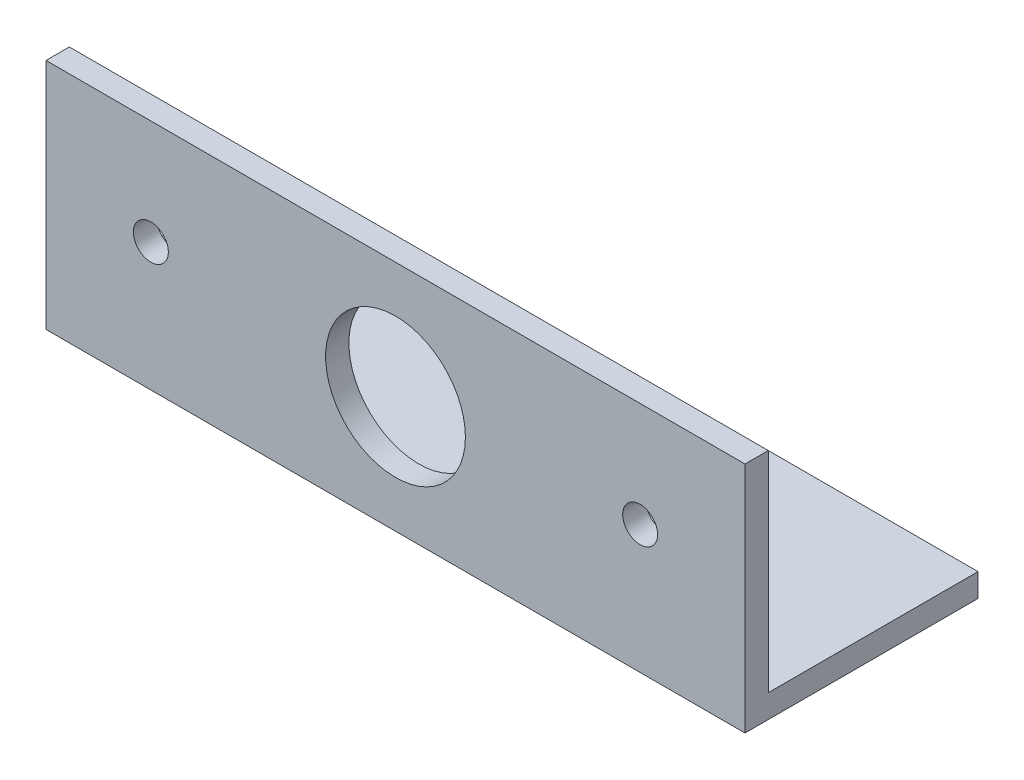
ISO-10303-21;
HEADER;
FILE_DESCRIPTION(('STEP AP214'),'2;1');
FILE_NAME('part.step','',(''),(''),'','','');
FILE_SCHEMA(('AUTOMOTIVE_DESIGN { 1 0 10303 214 1 1 1 1 }'));
ENDSEC;
DATA;
#1=APPLICATION_CONTEXT('core data for automotive mechanical design processes');
#2=APPLICATION_PROTOCOL_DEFINITION('international standard','automotive_design',2000,#1);
#3=PRODUCT_CONTEXT('',#1,'mechanical');
#4=PRODUCT('Part','Part','',(#3));
#5=PRODUCT_RELATED_PRODUCT_CATEGORY('part','',(#4));
#6=PRODUCT_DEFINITION_FORMATION('','',#4);
#7=PRODUCT_DEFINITION_CONTEXT('part definition',#1,'design');
#8=PRODUCT_DEFINITION('design','',#6,#7);
#9=PRODUCT_DEFINITION_SHAPE('','',#8);
#10=(LENGTH_UNIT() NAMED_UNIT(*) SI_UNIT(.MILLI.,.METRE.));
#11=(NAMED_UNIT(*) PLANE_ANGLE_UNIT() SI_UNIT($,.RADIAN.));
#12=(NAMED_UNIT(*) SI_UNIT($,.STERADIAN.) SOLID_ANGLE_UNIT());
#13=UNCERTAINTY_MEASURE_WITH_UNIT(LENGTH_MEASURE(1.E-05),#10,'distance_accuracy_value','');
#14=(GEOMETRIC_REPRESENTATION_CONTEXT(3) GLOBAL_UNCERTAINTY_ASSIGNED_CONTEXT((#13)) GLOBAL_UNIT_ASSIGNED_CONTEXT((#10,
#11,#12)) REPRESENTATION_CONTEXT('',''));
#15=CARTESIAN_POINT('',(0.,0.,0.));
#16=DIRECTION('',(0.,0.,1.));
#17=DIRECTION('',(1.,0.,0.));
#18=AXIS2_PLACEMENT_3D('',#15,#16,#17);
#19=CARTESIAN_POINT('',(-30.,20.,0.));
#20=DIRECTION('',(0.,1.,0.));
#21=DIRECTION('',(0.,0.,1.));
#22=AXIS2_PLACEMENT_3D('',#19,#20,#21);
#23=PLANE('',#22);
#24=DIRECTION('',(1.,0.,0.));
#25=VECTOR('',#24,1.);
#26=CARTESIAN_POINT('',(-30.,20.,0.));
#27=LINE('',#26,#25);
#28=CARTESIAN_POINT('',(-30.,20.,0.));
#29=VERTEX_POINT('',#28);
#30=CARTESIAN_POINT('',(30.,20.,0.));
#31=VERTEX_POINT('',#30);
#32=EDGE_CURVE('E44',#29,#31,#27,.T.);
#33=ORIENTED_EDGE('',*,*,#32,.T.);
#34=DIRECTION('',(0.,0.,1.));
#35=VECTOR('',#34,1.);
#36=CARTESIAN_POINT('',(30.,20.,0.));
#37=LINE('',#36,#35);
#38=CARTESIAN_POINT('',(30.,20.,-2.));
#39=VERTEX_POINT('',#38);
#40=EDGE_CURVE('E93',#39,#31,#37,.T.);
#41=ORIENTED_EDGE('',*,*,#40,.F.);
#42=DIRECTION('',(1.,0.,0.));
#43=VECTOR('',#42,1.);
#44=CARTESIAN_POINT('',(-30.,20.,-2.));
#45=LINE('',#44,#43);
#46=CARTESIAN_POINT('',(-30.,20.,-2.));
#47=VERTEX_POINT('',#46);
#48=EDGE_CURVE('E11',#47,#39,#45,.T.);
#49=ORIENTED_EDGE('',*,*,#48,.F.);
#50=DIRECTION('',(0.,0.,1.));
#51=VECTOR('',#50,1.);
#52=CARTESIAN_POINT('',(-30.,20.,0.));
#53=LINE('',#52,#51);
#54=EDGE_CURVE('E94',#47,#29,#53,.T.);
#55=ORIENTED_EDGE('',*,*,#54,.T.);
#56=EDGE_LOOP('',(#33,#41,#49,#55));
#57=FACE_BOUND('',#56,.T.);
#58=ADVANCED_FACE('F41',(#57),#23,.T.);
#59=CARTESIAN_POINT('',(-30.,2.,-2.));
#60=DIRECTION('',(0.,0.,-1.));
#61=DIRECTION('',(0.,1.,0.));
#62=AXIS2_PLACEMENT_3D('',#59,#60,#61);
#63=PLANE('',#62);
#64=CARTESIAN_POINT('',(-21.,11.,-2.));
#65=DIRECTION('',(0.,0.,1.));
#66=DIRECTION('',(1.,0.,0.));
#67=AXIS2_PLACEMENT_3D('',#64,#65,#66);
#68=CIRCLE('',#67,1.5);
#69=CARTESIAN_POINT('',(-19.5,11.,-2.));
#70=VERTEX_POINT('',#69);
#71=EDGE_CURVE('E112',#70,#70,#68,.T.);
#72=ORIENTED_EDGE('',*,*,#71,.T.);
#73=EDGE_LOOP('',(#72));
#74=FACE_BOUND('',#73,.T.);
#75=CARTESIAN_POINT('',(21.,11.,-2.));
#76=DIRECTION('',(0.,0.,1.));
#77=DIRECTION('',(1.,0.,0.));
#78=AXIS2_PLACEMENT_3D('',#75,#76,#77);
#79=CIRCLE('',#78,1.5);
#80=CARTESIAN_POINT('',(22.5,11.,-2.));
#81=VERTEX_POINT('',#80);
#82=EDGE_CURVE('E192',#81,#81,#79,.T.);
#83=ORIENTED_EDGE('',*,*,#82,.T.);
#84=EDGE_LOOP('',(#83));
#85=FACE_BOUND('',#84,.T.);
#86=CARTESIAN_POINT('',(0.,10.,-2.));
#87=DIRECTION('',(0.,0.,1.));
#88=DIRECTION('',(1.,0.,0.));
#89=AXIS2_PLACEMENT_3D('',#86,#87,#88);
#90=CIRCLE('',#89,6.);
#91=CARTESIAN_POINT('',(6.,10.,-2.));
#92=VERTEX_POINT('',#91);
#93=EDGE_CURVE('E118',#92,#92,#90,.T.);
#94=ORIENTED_EDGE('',*,*,#93,.T.);
#95=EDGE_LOOP('',(#94));
#96=FACE_BOUND('',#95,.T.);
#97=ORIENTED_EDGE('',*,*,#48,.T.);
#98=DIRECTION('',(0.,1.,0.));
#99=VECTOR('',#98,1.);
#100=CARTESIAN_POINT('',(30.,2.,-2.));
#101=LINE('',#100,#99);
#102=CARTESIAN_POINT('',(30.,2.,-2.));
#103=VERTEX_POINT('',#102);
#104=EDGE_CURVE('E111',#103,#39,#101,.T.);
#105=ORIENTED_EDGE('',*,*,#104,.F.);
#106=DIRECTION('',(1.,0.,0.));
#107=VECTOR('',#106,1.);
#108=CARTESIAN_POINT('',(-30.,2.,-2.));
#109=LINE('',#108,#107);
#110=CARTESIAN_POINT('',(-30.,2.,-2.));
#111=VERTEX_POINT('',#110);
#112=EDGE_CURVE('E49',#111,#103,#109,.T.);
#113=ORIENTED_EDGE('',*,*,#112,.F.);
#114=DIRECTION('',(0.,1.,0.));
#115=VECTOR('',#114,1.);
#116=CARTESIAN_POINT('',(-30.,2.,-2.));
#117=LINE('',#116,#115);
#118=EDGE_CURVE('E99',#111,#47,#117,.T.);
#119=ORIENTED_EDGE('',*,*,#118,.T.);
#120=EDGE_LOOP('',(#97,#105,#113,#119));
#121=FACE_BOUND('',#120,.T.);
#122=ADVANCED_FACE('F158',(#74,#85,#96,#121),#63,.T.);
#123=CARTESIAN_POINT('',(-30.,2.,-20.));
#124=DIRECTION('',(0.,1.,0.));
#125=DIRECTION('',(0.,0.,1.));
#126=AXIS2_PLACEMENT_3D('',#123,#124,#125);
#127=PLANE('',#126);
#128=ORIENTED_EDGE('',*,*,#112,.T.);
#129=DIRECTION('',(0.,0.,1.));
#130=VECTOR('',#129,1.);
#131=CARTESIAN_POINT('',(30.,2.,-20.));
#132=LINE('',#131,#130);
#133=CARTESIAN_POINT('',(30.,2.,-20.));
#134=VERTEX_POINT('',#133);
#135=EDGE_CURVE('E125',#134,#103,#132,.T.);
#136=ORIENTED_EDGE('',*,*,#135,.F.);
#137=DIRECTION('',(1.,0.,0.));
#138=VECTOR('',#137,1.);
#139=CARTESIAN_POINT('',(-30.,2.,-20.));
#140=LINE('',#139,#138);
#141=CARTESIAN_POINT('',(-30.,2.,-20.));
#142=VERTEX_POINT('',#141);
#143=EDGE_CURVE('E141',#142,#134,#140,.T.);
#144=ORIENTED_EDGE('',*,*,#143,.F.);
#145=DIRECTION('',(0.,0.,1.));
#146=VECTOR('',#145,1.);
#147=CARTESIAN_POINT('',(-30.,2.,-20.));
#148=LINE('',#147,#146);
#149=EDGE_CURVE('E137',#142,#111,#148,.T.);
#150=ORIENTED_EDGE('',*,*,#149,.T.);
#151=EDGE_LOOP('',(#128,#136,#144,#150));
#152=FACE_BOUND('',#151,.T.);
#153=ADVANCED_FACE('F154',(#152),#127,.T.);
#154=CARTESIAN_POINT('',(-30.,0.,-20.));
#155=DIRECTION('',(0.,0.,-1.));
#156=DIRECTION('',(-1.,0.,0.));
#157=AXIS2_PLACEMENT_3D('',#154,#155,#156);
#158=PLANE('',#157);
#159=ORIENTED_EDGE('',*,*,#143,.T.);
#160=DIRECTION('',(0.,1.,0.));
#161=VECTOR('',#160,1.);
#162=CARTESIAN_POINT('',(30.,0.,-20.));
#163=LINE('',#162,#161);
#164=CARTESIAN_POINT('',(30.,0.,-20.));
#165=VERTEX_POINT('',#164);
#166=EDGE_CURVE('E122',#165,#134,#163,.T.);
#167=ORIENTED_EDGE('',*,*,#166,.F.);
#168=DIRECTION('',(1.,0.,0.));
#169=VECTOR('',#168,1.);
#170=CARTESIAN_POINT('',(-30.,0.,-20.));
#171=LINE('',#170,#169);
#172=CARTESIAN_POINT('',(-30.,0.,-20.));
#173=VERTEX_POINT('',#172);
#174=EDGE_CURVE('E143',#173,#165,#171,.T.);
#175=ORIENTED_EDGE('',*,*,#174,.F.);
#176=DIRECTION('',(0.,1.,0.));
#177=VECTOR('',#176,1.);
#178=CARTESIAN_POINT('',(-30.,0.,-20.));
#179=LINE('',#178,#177);
#180=EDGE_CURVE('E134',#173,#142,#179,.T.);
#181=ORIENTED_EDGE('',*,*,#180,.T.);
#182=EDGE_LOOP('',(#159,#167,#175,#181));
#183=FACE_BOUND('',#182,.T.);
#184=ADVANCED_FACE('F151',(#183),#158,.T.);
#185=CARTESIAN_POINT('',(-30.,0.,0.));
#186=DIRECTION('',(0.,-1.,0.));
#187=DIRECTION('',(0.,0.,-1.));
#188=AXIS2_PLACEMENT_3D('',#185,#186,#187);
#189=PLANE('',#188);
#190=ORIENTED_EDGE('',*,*,#174,.T.);
#191=DIRECTION('',(0.,0.,-1.));
#192=VECTOR('',#191,1.);
#193=CARTESIAN_POINT('',(30.,0.,0.));
#194=LINE('',#193,#192);
#195=CARTESIAN_POINT('',(30.,0.,0.));
#196=VERTEX_POINT('',#195);
#197=EDGE_CURVE('E106',#196,#165,#194,.T.);
#198=ORIENTED_EDGE('',*,*,#197,.F.);
#199=DIRECTION('',(1.,0.,0.));
#200=VECTOR('',#199,1.);
#201=CARTESIAN_POINT('',(-30.,0.,0.));
#202=LINE('',#201,#200);
#203=CARTESIAN_POINT('',(-30.,0.,0.));
#204=VERTEX_POINT('',#203);
#205=EDGE_CURVE('E98',#204,#196,#202,.T.);
#206=ORIENTED_EDGE('',*,*,#205,.F.);
#207=DIRECTION('',(0.,0.,-1.));
#208=VECTOR('',#207,1.);
#209=CARTESIAN_POINT('',(-30.,0.,0.));
#210=LINE('',#209,#208);
#211=EDGE_CURVE('E131',#204,#173,#210,.T.);
#212=ORIENTED_EDGE('',*,*,#211,.T.);
#213=EDGE_LOOP('',(#190,#198,#206,#212));
#214=FACE_BOUND('',#213,.T.);
#215=ADVANCED_FACE('F145',(#214),#189,.T.);
#216=CARTESIAN_POINT('',(-30.,20.,0.));
#217=DIRECTION('',(0.,0.,1.));
#218=DIRECTION('',(1.,0.,0.));
#219=AXIS2_PLACEMENT_3D('',#216,#217,#218);
#220=PLANE('',#219);
#221=CARTESIAN_POINT('',(-21.,11.,0.));
#222=DIRECTION('',(0.,0.,1.));
#223=DIRECTION('',(1.,0.,0.));
#224=AXIS2_PLACEMENT_3D('',#221,#222,#223);
#225=CIRCLE('',#224,1.5);
#226=CARTESIAN_POINT('',(-19.5,11.,0.));
#227=VERTEX_POINT('',#226);
#228=EDGE_CURVE('E115',#227,#227,#225,.T.);
#229=ORIENTED_EDGE('',*,*,#228,.F.);
#230=EDGE_LOOP('',(#229));
#231=FACE_BOUND('',#230,.T.);
#232=CARTESIAN_POINT('',(21.,11.,0.));
#233=DIRECTION('',(0.,0.,1.));
#234=DIRECTION('',(1.,0.,0.));
#235=AXIS2_PLACEMENT_3D('',#232,#233,#234);
#236=CIRCLE('',#235,1.5);
#237=CARTESIAN_POINT('',(22.5,11.,0.));
#238=VERTEX_POINT('',#237);
#239=EDGE_CURVE('E187',#238,#238,#236,.T.);
#240=ORIENTED_EDGE('',*,*,#239,.F.);
#241=EDGE_LOOP('',(#240));
#242=FACE_BOUND('',#241,.T.);
#243=CARTESIAN_POINT('',(0.,10.,0.));
#244=DIRECTION('',(0.,0.,1.));
#245=DIRECTION('',(1.,0.,0.));
#246=AXIS2_PLACEMENT_3D('',#243,#244,#245);
#247=CIRCLE('',#246,6.);
#248=CARTESIAN_POINT('',(6.,10.,0.));
#249=VERTEX_POINT('',#248);
#250=EDGE_CURVE('E190',#249,#249,#247,.T.);
#251=ORIENTED_EDGE('',*,*,#250,.F.);
#252=EDGE_LOOP('',(#251));
#253=FACE_BOUND('',#252,.T.);
#254=ORIENTED_EDGE('',*,*,#205,.T.);
#255=DIRECTION('',(0.,-1.,0.));
#256=VECTOR('',#255,1.);
#257=CARTESIAN_POINT('',(30.,20.,0.));
#258=LINE('',#257,#256);
#259=EDGE_CURVE('E101',#31,#196,#258,.T.);
#260=ORIENTED_EDGE('',*,*,#259,.F.);
#261=ORIENTED_EDGE('',*,*,#32,.F.);
#262=DIRECTION('',(0.,-1.,0.));
#263=VECTOR('',#262,1.);
#264=CARTESIAN_POINT('',(-30.,20.,0.));
#265=LINE('',#264,#263);
#266=EDGE_CURVE('E129',#29,#204,#265,.T.);
#267=ORIENTED_EDGE('',*,*,#266,.T.);
#268=EDGE_LOOP('',(#254,#260,#261,#267));
#269=FACE_BOUND('',#268,.T.);
#270=ADVANCED_FACE('F102',(#231,#242,#253,#269),#220,.T.);
#271=CARTESIAN_POINT('',(-30.,0.,0.));
#272=DIRECTION('',(1.,0.,0.));
#273=DIRECTION('',(0.,0.,-1.));
#274=AXIS2_PLACEMENT_3D('',#271,#272,#273);
#275=PLANE('',#274);
#276=ORIENTED_EDGE('',*,*,#54,.F.);
#277=ORIENTED_EDGE('',*,*,#118,.F.);
#278=ORIENTED_EDGE('',*,*,#149,.F.);
#279=ORIENTED_EDGE('',*,*,#180,.F.);
#280=ORIENTED_EDGE('',*,*,#211,.F.);
#281=ORIENTED_EDGE('',*,*,#266,.F.);
#282=EDGE_LOOP('',(#276,#277,#278,#279,#280,#281));
#283=FACE_BOUND('',#282,.T.);
#284=ADVANCED_FACE('F157',(#283),#275,.F.);
#285=CARTESIAN_POINT('',(30.,0.,0.));
#286=DIRECTION('',(1.,0.,0.));
#287=DIRECTION('',(0.,0.,-1.));
#288=AXIS2_PLACEMENT_3D('',#285,#286,#287);
#289=PLANE('',#288);
#290=ORIENTED_EDGE('',*,*,#40,.T.);
#291=ORIENTED_EDGE('',*,*,#259,.T.);
#292=ORIENTED_EDGE('',*,*,#197,.T.);
#293=ORIENTED_EDGE('',*,*,#166,.T.);
#294=ORIENTED_EDGE('',*,*,#135,.T.);
#295=ORIENTED_EDGE('',*,*,#104,.T.);
#296=EDGE_LOOP('',(#290,#291,#292,#293,#294,#295));
#297=FACE_BOUND('',#296,.T.);
#298=ADVANCED_FACE('F109',(#297),#289,.T.);
#299=CARTESIAN_POINT('',(0.,10.,-2.));
#300=DIRECTION('',(0.,0.,1.));
#301=DIRECTION('',(1.,0.,0.));
#302=AXIS2_PLACEMENT_3D('',#299,#300,#301);
#303=CYLINDRICAL_SURFACE('',#302,6.);
#304=ORIENTED_EDGE('',*,*,#93,.F.);
#305=EDGE_LOOP('',(#304));
#306=FACE_BOUND('',#305,.T.);
#307=ORIENTED_EDGE('',*,*,#250,.T.);
#308=EDGE_LOOP('',(#307));
#309=FACE_BOUND('',#308,.T.);
#310=ADVANCED_FACE('F207',(#306,#309),#303,.F.);
#311=CARTESIAN_POINT('',(21.,11.,-2.));
#312=DIRECTION('',(0.,0.,1.));
#313=DIRECTION('',(1.,0.,0.));
#314=AXIS2_PLACEMENT_3D('',#311,#312,#313);
#315=CYLINDRICAL_SURFACE('',#314,1.5);
#316=ORIENTED_EDGE('',*,*,#82,.F.);
#317=EDGE_LOOP('',(#316));
#318=FACE_BOUND('',#317,.T.);
#319=ORIENTED_EDGE('',*,*,#239,.T.);
#320=EDGE_LOOP('',(#319));
#321=FACE_BOUND('',#320,.T.);
#322=ADVANCED_FACE('F201',(#318,#321),#315,.F.);
#323=CARTESIAN_POINT('',(-21.,11.,-2.));
#324=DIRECTION('',(0.,0.,1.));
#325=DIRECTION('',(1.,0.,0.));
#326=AXIS2_PLACEMENT_3D('',#323,#324,#325);
#327=CYLINDRICAL_SURFACE('',#326,1.5);
#328=ORIENTED_EDGE('',*,*,#71,.F.);
#329=EDGE_LOOP('',(#328));
#330=FACE_BOUND('',#329,.T.);
#331=ORIENTED_EDGE('',*,*,#228,.T.);
#332=EDGE_LOOP('',(#331));
#333=FACE_BOUND('',#332,.T.);
#334=ADVANCED_FACE('F199',(#330,#333),#327,.F.);
#335=CLOSED_SHELL('',(#58,#122,#153,#184,#215,#270,#284,#298,#310,#322,#334));
#336=MANIFOLD_SOLID_BREP('B2',#335);
#337=ADVANCED_BREP_SHAPE_REPRESENTATION('',(#18,#336),#14);
#338=SHAPE_DEFINITION_REPRESENTATION(#9,#337);
ENDSEC;
END-ISO-10303-21;
